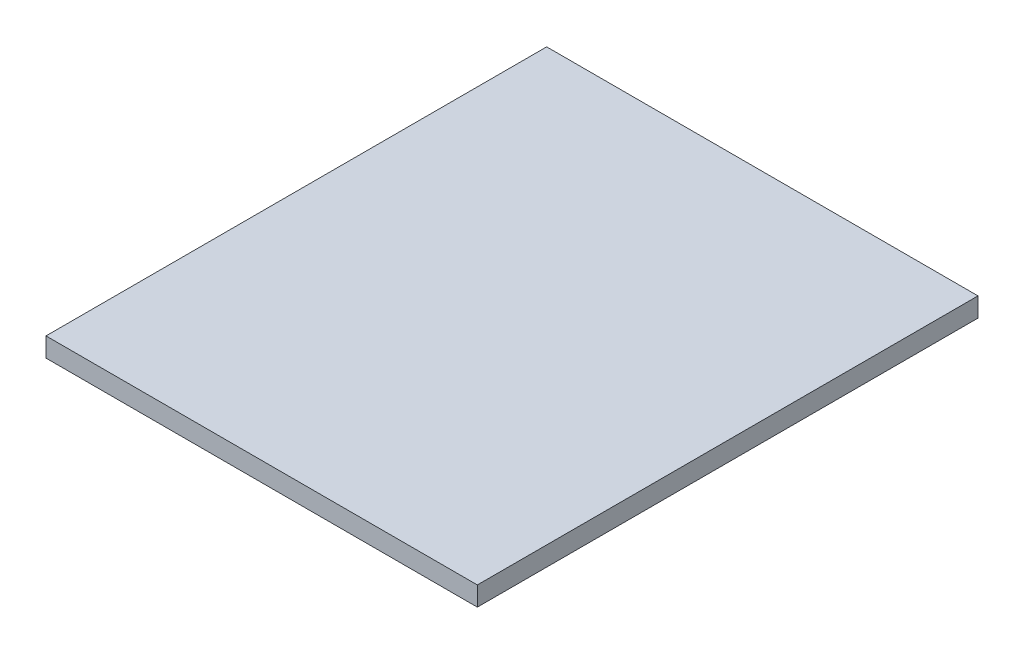
ISO-10303-21;
HEADER;
FILE_DESCRIPTION(('STEP AP214'),'2;1');
FILE_NAME('part.step','',(''),(''),'','','');
FILE_SCHEMA(('AUTOMOTIVE_DESIGN { 1 0 10303 214 1 1 1 1 }'));
ENDSEC;
DATA;
#1=APPLICATION_CONTEXT('core data for automotive mechanical design processes');
#2=APPLICATION_PROTOCOL_DEFINITION('international standard','automotive_design',2000,#1);
#3=PRODUCT_CONTEXT('',#1,'mechanical');
#4=PRODUCT('Part','Part','',(#3));
#5=PRODUCT_RELATED_PRODUCT_CATEGORY('part','',(#4));
#6=PRODUCT_DEFINITION_FORMATION('','',#4);
#7=PRODUCT_DEFINITION_CONTEXT('part definition',#1,'design');
#8=PRODUCT_DEFINITION('design','',#6,#7);
#9=PRODUCT_DEFINITION_SHAPE('','',#8);
#10=(LENGTH_UNIT() NAMED_UNIT(*) SI_UNIT(.MILLI.,.METRE.));
#11=(NAMED_UNIT(*) PLANE_ANGLE_UNIT() SI_UNIT($,.RADIAN.));
#12=(NAMED_UNIT(*) SI_UNIT($,.STERADIAN.) SOLID_ANGLE_UNIT());
#13=UNCERTAINTY_MEASURE_WITH_UNIT(LENGTH_MEASURE(1.E-05),#10,'distance_accuracy_value','');
#14=(GEOMETRIC_REPRESENTATION_CONTEXT(3) GLOBAL_UNCERTAINTY_ASSIGNED_CONTEXT((#13)) GLOBAL_UNIT_ASSIGNED_CONTEXT((#10,
#11,#12)) REPRESENTATION_CONTEXT('',''));
#15=CARTESIAN_POINT('',(0.,0.,0.));
#16=DIRECTION('',(0.,0.,1.));
#17=DIRECTION('',(1.,0.,0.));
#18=AXIS2_PLACEMENT_3D('',#15,#16,#17);
#19=CARTESIAN_POINT('',(106.,5.,-130.));
#20=DIRECTION('',(-1.,0.,0.));
#21=DIRECTION('',(0.,0.,1.));
#22=AXIS2_PLACEMENT_3D('',#19,#20,#21);
#23=PLANE('',#22);
#24=DIRECTION('',(0.,0.,-1.));
#25=VECTOR('',#24,1.);
#26=CARTESIAN_POINT('',(106.,0.,-130.));
#27=LINE('',#26,#25);
#28=CARTESIAN_POINT('',(106.,0.,0.));
#29=VERTEX_POINT('',#28);
#30=CARTESIAN_POINT('',(106.,0.,-130.));
#31=VERTEX_POINT('',#30);
#32=EDGE_CURVE('E96',#29,#31,#27,.T.);
#33=ORIENTED_EDGE('',*,*,#32,.T.);
#34=DIRECTION('',(0.,-1.,0.));
#35=VECTOR('',#34,1.);
#36=CARTESIAN_POINT('',(106.,5.,-130.));
#37=LINE('',#36,#35);
#38=CARTESIAN_POINT('',(106.,5.,-130.));
#39=VERTEX_POINT('',#38);
#40=EDGE_CURVE('E11',#39,#31,#37,.T.);
#41=ORIENTED_EDGE('',*,*,#40,.F.);
#42=DIRECTION('',(0.,0.,-1.));
#43=VECTOR('',#42,1.);
#44=CARTESIAN_POINT('',(106.,5.,-130.));
#45=LINE('',#44,#43);
#46=CARTESIAN_POINT('',(106.,5.,0.));
#47=VERTEX_POINT('',#46);
#48=EDGE_CURVE('E84',#47,#39,#45,.T.);
#49=ORIENTED_EDGE('',*,*,#48,.F.);
#50=DIRECTION('',(0.,-1.,0.));
#51=VECTOR('',#50,1.);
#52=CARTESIAN_POINT('',(106.,5.,0.));
#53=LINE('',#52,#51);
#54=EDGE_CURVE('E92',#47,#29,#53,.T.);
#55=ORIENTED_EDGE('',*,*,#54,.T.);
#56=EDGE_LOOP('',(#33,#41,#49,#55));
#57=FACE_BOUND('',#56,.T.);
#58=ADVANCED_FACE('F33',(#57),#23,.F.);
#59=CARTESIAN_POINT('',(-6.00000000000002,5.,-130.));
#60=DIRECTION('',(0.,0.,1.));
#61=DIRECTION('',(1.,0.,0.));
#62=AXIS2_PLACEMENT_3D('',#59,#60,#61);
#63=PLANE('',#62);
#64=DIRECTION('',(-1.,0.,0.));
#65=VECTOR('',#64,1.);
#66=CARTESIAN_POINT('',(-6.00000000000002,0.,-130.));
#67=LINE('',#66,#65);
#68=CARTESIAN_POINT('',(-6.00000000000002,0.,-130.));
#69=VERTEX_POINT('',#68);
#70=EDGE_CURVE('E88',#31,#69,#67,.T.);
#71=ORIENTED_EDGE('',*,*,#70,.T.);
#72=DIRECTION('',(0.,-1.,0.));
#73=VECTOR('',#72,1.);
#74=CARTESIAN_POINT('',(-6.00000000000002,5.,-130.));
#75=LINE('',#74,#73);
#76=CARTESIAN_POINT('',(-6.00000000000002,5.,-130.));
#77=VERTEX_POINT('',#76);
#78=EDGE_CURVE('E41',#77,#69,#75,.T.);
#79=ORIENTED_EDGE('',*,*,#78,.F.);
#80=DIRECTION('',(-1.,0.,0.));
#81=VECTOR('',#80,1.);
#82=CARTESIAN_POINT('',(-6.00000000000002,5.,-130.));
#83=LINE('',#82,#81);
#84=EDGE_CURVE('E79',#39,#77,#83,.T.);
#85=ORIENTED_EDGE('',*,*,#84,.F.);
#86=ORIENTED_EDGE('',*,*,#40,.T.);
#87=EDGE_LOOP('',(#71,#79,#85,#86));
#88=FACE_BOUND('',#87,.T.);
#89=ADVANCED_FACE('F87',(#88),#63,.F.);
#90=CARTESIAN_POINT('',(-6.00000000000002,5.,-130.));
#91=DIRECTION('',(1.,0.,0.));
#92=DIRECTION('',(0.,0.,-1.));
#93=AXIS2_PLACEMENT_3D('',#90,#91,#92);
#94=PLANE('',#93);
#95=DIRECTION('',(0.,0.,1.));
#96=VECTOR('',#95,1.);
#97=CARTESIAN_POINT('',(-6.00000000000002,0.,-130.));
#98=LINE('',#97,#96);
#99=CARTESIAN_POINT('',(-6.,0.,0.));
#100=VERTEX_POINT('',#99);
#101=EDGE_CURVE('E66',#69,#100,#98,.T.);
#102=ORIENTED_EDGE('',*,*,#101,.T.);
#103=DIRECTION('',(0.,-1.,0.));
#104=VECTOR('',#103,1.);
#105=CARTESIAN_POINT('',(-6.,5.,0.));
#106=LINE('',#105,#104);
#107=CARTESIAN_POINT('',(-6.,5.,0.));
#108=VERTEX_POINT('',#107);
#109=EDGE_CURVE('E89',#108,#100,#106,.T.);
#110=ORIENTED_EDGE('',*,*,#109,.F.);
#111=DIRECTION('',(0.,0.,1.));
#112=VECTOR('',#111,1.);
#113=CARTESIAN_POINT('',(-6.00000000000002,5.,-130.));
#114=LINE('',#113,#112);
#115=EDGE_CURVE('E82',#77,#108,#114,.T.);
#116=ORIENTED_EDGE('',*,*,#115,.F.);
#117=ORIENTED_EDGE('',*,*,#78,.T.);
#118=EDGE_LOOP('',(#102,#110,#116,#117));
#119=FACE_BOUND('',#118,.T.);
#120=ADVANCED_FACE('F90',(#119),#94,.F.);
#121=CARTESIAN_POINT('',(-6.,5.,0.));
#122=DIRECTION('',(0.,0.,-1.));
#123=DIRECTION('',(-1.,0.,0.));
#124=AXIS2_PLACEMENT_3D('',#121,#122,#123);
#125=PLANE('',#124);
#126=DIRECTION('',(1.,0.,0.));
#127=VECTOR('',#126,1.);
#128=CARTESIAN_POINT('',(-6.,0.,0.));
#129=LINE('',#128,#127);
#130=EDGE_CURVE('E72',#100,#29,#129,.T.);
#131=ORIENTED_EDGE('',*,*,#130,.T.);
#132=ORIENTED_EDGE('',*,*,#54,.F.);
#133=DIRECTION('',(1.,0.,0.));
#134=VECTOR('',#133,1.);
#135=CARTESIAN_POINT('',(-6.,5.,0.));
#136=LINE('',#135,#134);
#137=EDGE_CURVE('E49',#108,#47,#136,.T.);
#138=ORIENTED_EDGE('',*,*,#137,.F.);
#139=ORIENTED_EDGE('',*,*,#109,.T.);
#140=EDGE_LOOP('',(#131,#132,#138,#139));
#141=FACE_BOUND('',#140,.T.);
#142=ADVANCED_FACE('F103',(#141),#125,.F.);
#143=CARTESIAN_POINT('',(0.,5.,0.));
#144=DIRECTION('',(0.,1.,0.));
#145=DIRECTION('',(0.,0.,1.));
#146=AXIS2_PLACEMENT_3D('',#143,#144,#145);
#147=PLANE('',#146);
#148=ORIENTED_EDGE('',*,*,#48,.T.);
#149=ORIENTED_EDGE('',*,*,#84,.T.);
#150=ORIENTED_EDGE('',*,*,#115,.T.);
#151=ORIENTED_EDGE('',*,*,#137,.T.);
#152=EDGE_LOOP('',(#148,#149,#150,#151));
#153=FACE_BOUND('',#152,.T.);
#154=ADVANCED_FACE('F80',(#153),#147,.T.);
#155=CARTESIAN_POINT('',(0.,0.,0.));
#156=DIRECTION('',(0.,1.,0.));
#157=DIRECTION('',(0.,0.,1.));
#158=AXIS2_PLACEMENT_3D('',#155,#156,#157);
#159=PLANE('',#158);
#160=ORIENTED_EDGE('',*,*,#32,.F.);
#161=ORIENTED_EDGE('',*,*,#130,.F.);
#162=ORIENTED_EDGE('',*,*,#101,.F.);
#163=ORIENTED_EDGE('',*,*,#70,.F.);
#164=EDGE_LOOP('',(#160,#161,#162,#163));
#165=FACE_BOUND('',#164,.T.);
#166=ADVANCED_FACE('F106',(#165),#159,.F.);
#167=CLOSED_SHELL('',(#58,#89,#120,#142,#154,#166));
#168=MANIFOLD_SOLID_BREP('B2',#167);
#169=ADVANCED_BREP_SHAPE_REPRESENTATION('',(#18,#168),#14);
#170=SHAPE_DEFINITION_REPRESENTATION(#9,#169);
ENDSEC;
END-ISO-10303-21;
